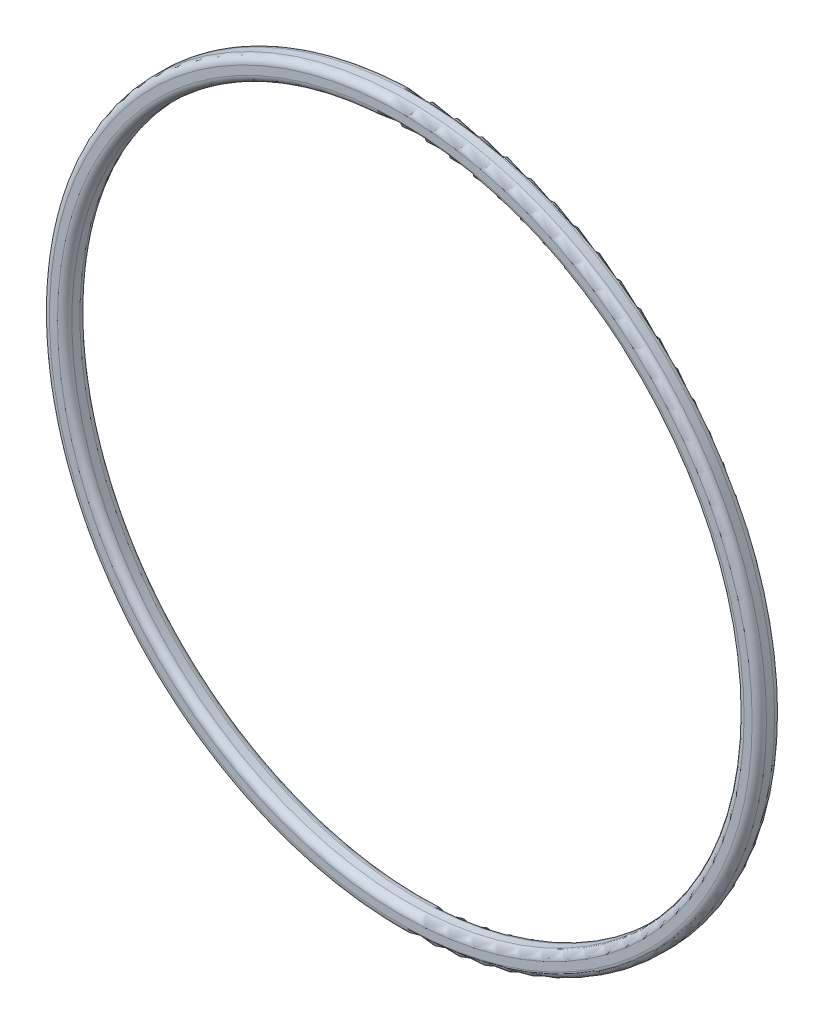
ISO-10303-21;
HEADER;
FILE_DESCRIPTION(('STEP AP214'),'2;1');
FILE_NAME('part.step','',(''),(''),'','','');
FILE_SCHEMA(('AUTOMOTIVE_DESIGN { 1 0 10303 214 1 1 1 1 }'));
ENDSEC;
DATA;
#1=APPLICATION_CONTEXT('core data for automotive mechanical design processes');
#2=APPLICATION_PROTOCOL_DEFINITION('international standard','automotive_design',2000,#1);
#3=PRODUCT_CONTEXT('',#1,'mechanical');
#4=PRODUCT('Part','Part','',(#3));
#5=PRODUCT_RELATED_PRODUCT_CATEGORY('part','',(#4));
#6=PRODUCT_DEFINITION_FORMATION('','',#4);
#7=PRODUCT_DEFINITION_CONTEXT('part definition',#1,'design');
#8=PRODUCT_DEFINITION('design','',#6,#7);
#9=PRODUCT_DEFINITION_SHAPE('','',#8);
#10=(LENGTH_UNIT() NAMED_UNIT(*) SI_UNIT(.MILLI.,.METRE.));
#11=(NAMED_UNIT(*) PLANE_ANGLE_UNIT() SI_UNIT($,.RADIAN.));
#12=(NAMED_UNIT(*) SI_UNIT($,.STERADIAN.) SOLID_ANGLE_UNIT());
#13=UNCERTAINTY_MEASURE_WITH_UNIT(LENGTH_MEASURE(1.E-05),#10,'distance_accuracy_value','');
#14=(GEOMETRIC_REPRESENTATION_CONTEXT(3) GLOBAL_UNCERTAINTY_ASSIGNED_CONTEXT((#13)) GLOBAL_UNIT_ASSIGNED_CONTEXT((#10,
#11,#12)) REPRESENTATION_CONTEXT('',''));
#15=CARTESIAN_POINT('',(0.,0.,0.));
#16=DIRECTION('',(0.,0.,1.));
#17=DIRECTION('',(1.,0.,0.));
#18=AXIS2_PLACEMENT_3D('',#15,#16,#17);
#19=CARTESIAN_POINT('',(0.,0.,1.5875));
#20=DIRECTION('',(0.,0.,1.));
#21=DIRECTION('',(1.,0.,0.));
#22=AXIS2_PLACEMENT_3D('',#19,#20,#21);
#23=PLANE('',#22);
#24=CARTESIAN_POINT('',(0.,0.,1.5875));
#25=DIRECTION('',(0.,0.,1.));
#26=DIRECTION('',(1.,0.,0.));
#27=AXIS2_PLACEMENT_3D('',#24,#25,#26);
#28=CIRCLE('',#27,24.3205);
#29=CARTESIAN_POINT('',(24.3205,0.,1.5875));
#30=VERTEX_POINT('',#29);
#31=EDGE_CURVE('E51',#30,#30,#28,.F.);
#32=ORIENTED_EDGE('',*,*,#31,.T.);
#33=EDGE_LOOP('',(#32));
#34=FACE_BOUND('',#33,.T.);
#35=CARTESIAN_POINT('',(0.,0.,1.5875));
#36=DIRECTION('',(0.,0.,1.));
#37=DIRECTION('',(1.,0.,0.));
#38=AXIS2_PLACEMENT_3D('',#35,#36,#37);
#39=CIRCLE('',#38,24.892);
#40=CARTESIAN_POINT('',(24.892,0.,1.5875));
#41=VERTEX_POINT('',#40);
#42=EDGE_CURVE('E54',#41,#41,#39,.T.);
#43=ORIENTED_EDGE('',*,*,#42,.T.);
#44=EDGE_LOOP('',(#43));
#45=FACE_BOUND('',#44,.T.);
#46=ADVANCED_FACE('F31',(#34,#45),#23,.T.);
#47=CARTESIAN_POINT('',(0.,0.,0.));
#48=DIRECTION('',(0.,0.,1.));
#49=DIRECTION('',(1.,0.,0.));
#50=AXIS2_PLACEMENT_3D('',#47,#48,#49);
#51=PLANE('',#50);
#52=CARTESIAN_POINT('',(0.,0.,0.));
#53=DIRECTION('',(0.,0.,1.));
#54=DIRECTION('',(1.,0.,0.));
#55=AXIS2_PLACEMENT_3D('',#52,#53,#54);
#56=CIRCLE('',#55,24.3205);
#57=CARTESIAN_POINT('',(24.3205,0.,0.));
#58=VERTEX_POINT('',#57);
#59=EDGE_CURVE('E42',#58,#58,#56,.T.);
#60=ORIENTED_EDGE('',*,*,#59,.T.);
#61=EDGE_LOOP('',(#60));
#62=FACE_BOUND('',#61,.T.);
#63=CARTESIAN_POINT('',(0.,0.,0.));
#64=DIRECTION('',(0.,0.,1.));
#65=DIRECTION('',(1.,0.,0.));
#66=AXIS2_PLACEMENT_3D('',#63,#64,#65);
#67=CIRCLE('',#66,24.892);
#68=CARTESIAN_POINT('',(24.892,0.,0.));
#69=VERTEX_POINT('',#68);
#70=EDGE_CURVE('E46',#69,#69,#67,.F.);
#71=ORIENTED_EDGE('',*,*,#70,.T.);
#72=EDGE_LOOP('',(#71));
#73=FACE_BOUND('',#72,.T.);
#74=ADVANCED_FACE('F74',(#62,#73),#51,.F.);
#75=CARTESIAN_POINT('',(0.,0.,1.5875));
#76=DIRECTION('',(0.,0.,-1.));
#77=DIRECTION('',(-1.,0.,0.));
#78=AXIS2_PLACEMENT_3D('',#75,#76,#77);
#79=CYLINDRICAL_SURFACE('',#78,25.4);
#80=CARTESIAN_POINT('',(0.,0.,0.508));
#81=DIRECTION('',(0.,0.,1.));
#82=DIRECTION('',(1.,0.,0.));
#83=AXIS2_PLACEMENT_3D('',#80,#81,#82);
#84=CIRCLE('',#83,25.4);
#85=CARTESIAN_POINT('',(25.4,0.,0.508));
#86=VERTEX_POINT('',#85);
#87=EDGE_CURVE('E10',#86,#86,#84,.T.);
#88=ORIENTED_EDGE('',*,*,#87,.T.);
#89=EDGE_LOOP('',(#88));
#90=FACE_BOUND('',#89,.T.);
#91=CARTESIAN_POINT('',(0.,0.,1.0795));
#92=DIRECTION('',(0.,0.,1.));
#93=DIRECTION('',(1.,0.,0.));
#94=AXIS2_PLACEMENT_3D('',#91,#92,#93);
#95=CIRCLE('',#94,25.4);
#96=CARTESIAN_POINT('',(25.4,0.,1.0795));
#97=VERTEX_POINT('',#96);
#98=EDGE_CURVE('E38',#97,#97,#95,.F.);
#99=ORIENTED_EDGE('',*,*,#98,.T.);
#100=EDGE_LOOP('',(#99));
#101=FACE_BOUND('',#100,.T.);
#102=ADVANCED_FACE('F77',(#90,#101),#79,.T.);
#103=CARTESIAN_POINT('',(0.,0.,1.5875));
#104=DIRECTION('',(0.,0.,-1.));
#105=DIRECTION('',(-1.,0.,0.));
#106=AXIS2_PLACEMENT_3D('',#103,#104,#105);
#107=CYLINDRICAL_SURFACE('',#106,23.8125);
#108=CARTESIAN_POINT('',(0.,0.,1.0795));
#109=DIRECTION('',(0.,0.,1.));
#110=DIRECTION('',(1.,0.,0.));
#111=AXIS2_PLACEMENT_3D('',#108,#109,#110);
#112=CIRCLE('',#111,23.8125);
#113=CARTESIAN_POINT('',(23.8125,0.,1.0795));
#114=VERTEX_POINT('',#113);
#115=EDGE_CURVE('E57',#114,#114,#112,.T.);
#116=ORIENTED_EDGE('',*,*,#115,.T.);
#117=EDGE_LOOP('',(#116));
#118=FACE_BOUND('',#117,.T.);
#119=CARTESIAN_POINT('',(0.,0.,0.508));
#120=DIRECTION('',(0.,0.,1.));
#121=DIRECTION('',(1.,0.,0.));
#122=AXIS2_PLACEMENT_3D('',#119,#120,#121);
#123=CIRCLE('',#122,23.8125);
#124=CARTESIAN_POINT('',(23.8125,0.,0.508));
#125=VERTEX_POINT('',#124);
#126=EDGE_CURVE('E60',#125,#125,#123,.F.);
#127=ORIENTED_EDGE('',*,*,#126,.T.);
#128=EDGE_LOOP('',(#127));
#129=FACE_BOUND('',#128,.T.);
#130=ADVANCED_FACE('F64',(#118,#129),#107,.F.);
#131=CARTESIAN_POINT('',(0.,0.,1.0795));
#132=DIRECTION('',(0.,0.,1.));
#133=DIRECTION('',(1.,0.,0.));
#134=AXIS2_PLACEMENT_3D('',#131,#132,#133);
#135=TOROIDAL_SURFACE('',#134,24.3205,0.508);
#136=ORIENTED_EDGE('',*,*,#31,.F.);
#137=EDGE_LOOP('',(#136));
#138=FACE_BOUND('',#137,.T.);
#139=ORIENTED_EDGE('',*,*,#115,.F.);
#140=EDGE_LOOP('',(#139));
#141=FACE_BOUND('',#140,.T.);
#142=ADVANCED_FACE('F70',(#138,#141),#135,.T.);
#143=CARTESIAN_POINT('',(0.,0.,0.508));
#144=DIRECTION('',(0.,0.,1.));
#145=DIRECTION('',(1.,0.,0.));
#146=AXIS2_PLACEMENT_3D('',#143,#144,#145);
#147=TOROIDAL_SURFACE('',#146,24.3205,0.508);
#148=ORIENTED_EDGE('',*,*,#126,.F.);
#149=EDGE_LOOP('',(#148));
#150=FACE_BOUND('',#149,.T.);
#151=ORIENTED_EDGE('',*,*,#59,.F.);
#152=EDGE_LOOP('',(#151));
#153=FACE_BOUND('',#152,.T.);
#154=ADVANCED_FACE('F66',(#150,#153),#147,.T.);
#155=CARTESIAN_POINT('',(0.,0.,0.508));
#156=DIRECTION('',(0.,0.,1.));
#157=DIRECTION('',(1.,0.,0.));
#158=AXIS2_PLACEMENT_3D('',#155,#156,#157);
#159=TOROIDAL_SURFACE('',#158,24.892,0.508);
#160=ORIENTED_EDGE('',*,*,#70,.F.);
#161=EDGE_LOOP('',(#160));
#162=FACE_BOUND('',#161,.T.);
#163=ORIENTED_EDGE('',*,*,#87,.F.);
#164=EDGE_LOOP('',(#163));
#165=FACE_BOUND('',#164,.T.);
#166=ADVANCED_FACE('F69',(#162,#165),#159,.T.);
#167=CARTESIAN_POINT('',(0.,0.,1.0795));
#168=DIRECTION('',(0.,0.,1.));
#169=DIRECTION('',(1.,0.,0.));
#170=AXIS2_PLACEMENT_3D('',#167,#168,#169);
#171=TOROIDAL_SURFACE('',#170,24.892,0.508);
#172=ORIENTED_EDGE('',*,*,#98,.F.);
#173=EDGE_LOOP('',(#172));
#174=FACE_BOUND('',#173,.T.);
#175=ORIENTED_EDGE('',*,*,#42,.F.);
#176=EDGE_LOOP('',(#175));
#177=FACE_BOUND('',#176,.T.);
#178=ADVANCED_FACE('F33',(#174,#177),#171,.T.);
#179=CLOSED_SHELL('',(#46,#74,#102,#130,#142,#154,#166,#178));
#180=MANIFOLD_SOLID_BREP('B2',#179);
#181=ADVANCED_BREP_SHAPE_REPRESENTATION('',(#18,#180),#14);
#182=SHAPE_DEFINITION_REPRESENTATION(#9,#181);
ENDSEC;
END-ISO-10303-21;
